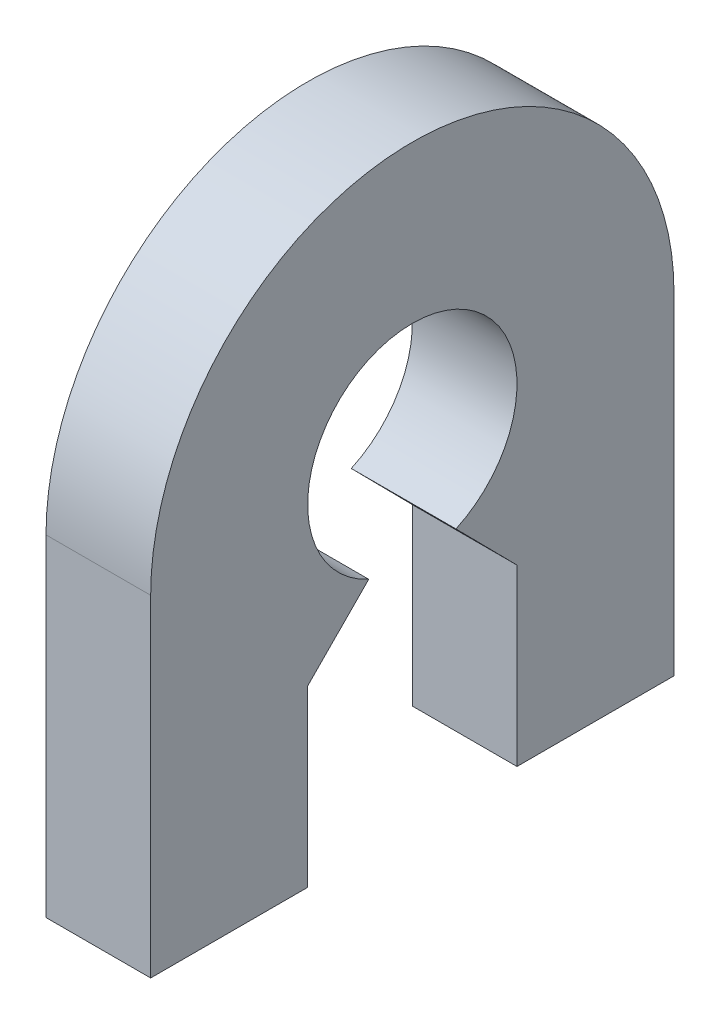
ISO-10303-21;
HEADER;
FILE_DESCRIPTION(('STEP AP214'),'2;1');
FILE_NAME('part.step','',(''),(''),'','','');
FILE_SCHEMA(('AUTOMOTIVE_DESIGN { 1 0 10303 214 1 1 1 1 }'));
ENDSEC;
DATA;
#1=APPLICATION_CONTEXT('core data for automotive mechanical design processes');
#2=APPLICATION_PROTOCOL_DEFINITION('international standard','automotive_design',2000,#1);
#3=PRODUCT_CONTEXT('',#1,'mechanical');
#4=PRODUCT('Part','Part','',(#3));
#5=PRODUCT_RELATED_PRODUCT_CATEGORY('part','',(#4));
#6=PRODUCT_DEFINITION_FORMATION('','',#4);
#7=PRODUCT_DEFINITION_CONTEXT('part definition',#1,'design');
#8=PRODUCT_DEFINITION('design','',#6,#7);
#9=PRODUCT_DEFINITION_SHAPE('','',#8);
#10=(LENGTH_UNIT() NAMED_UNIT(*) SI_UNIT(.MILLI.,.METRE.));
#11=(NAMED_UNIT(*) PLANE_ANGLE_UNIT() SI_UNIT($,.RADIAN.));
#12=(NAMED_UNIT(*) SI_UNIT($,.STERADIAN.) SOLID_ANGLE_UNIT());
#13=UNCERTAINTY_MEASURE_WITH_UNIT(LENGTH_MEASURE(1.E-05),#10,'distance_accuracy_value','');
#14=(GEOMETRIC_REPRESENTATION_CONTEXT(3) GLOBAL_UNCERTAINTY_ASSIGNED_CONTEXT((#13)) GLOBAL_UNIT_ASSIGNED_CONTEXT((#10,
#11,#12)) REPRESENTATION_CONTEXT('',''));
#15=CARTESIAN_POINT('',(0.,0.,0.));
#16=DIRECTION('',(0.,0.,1.));
#17=DIRECTION('',(1.,0.,0.));
#18=AXIS2_PLACEMENT_3D('',#15,#16,#17);
#19=CARTESIAN_POINT('',(3.,24.,0.));
#20=DIRECTION('',(-1.,0.,0.));
#21=DIRECTION('',(0.,0.,1.));
#22=AXIS2_PLACEMENT_3D('',#19,#20,#21);
#23=CYLINDRICAL_SURFACE('',#22,15.);
#24=CARTESIAN_POINT('',(-3.,24.,0.));
#25=DIRECTION('',(1.,0.,0.));
#26=DIRECTION('',(0.,0.,1.));
#27=AXIS2_PLACEMENT_3D('',#24,#25,#26);
#28=CIRCLE('',#27,15.);
#29=CARTESIAN_POINT('',(-3.,24.,-15.));
#30=VERTEX_POINT('',#29);
#31=CARTESIAN_POINT('',(-3.,24.,15.));
#32=VERTEX_POINT('',#31);
#33=EDGE_CURVE('E143',#30,#32,#28,.T.);
#34=ORIENTED_EDGE('',*,*,#33,.T.);
#35=DIRECTION('',(-1.,0.,0.));
#36=VECTOR('',#35,1.);
#37=CARTESIAN_POINT('',(3.,24.,15.));
#38=LINE('',#37,#36);
#39=CARTESIAN_POINT('',(3.,24.,15.));
#40=VERTEX_POINT('',#39);
#41=EDGE_CURVE('E11',#40,#32,#38,.T.);
#42=ORIENTED_EDGE('',*,*,#41,.F.);
#43=CARTESIAN_POINT('',(3.,24.,0.));
#44=DIRECTION('',(1.,0.,0.));
#45=DIRECTION('',(0.,0.,1.));
#46=AXIS2_PLACEMENT_3D('',#43,#44,#45);
#47=CIRCLE('',#46,15.);
#48=CARTESIAN_POINT('',(3.,24.,-15.));
#49=VERTEX_POINT('',#48);
#50=EDGE_CURVE('E161',#49,#40,#47,.T.);
#51=ORIENTED_EDGE('',*,*,#50,.F.);
#52=DIRECTION('',(-1.,0.,0.));
#53=VECTOR('',#52,1.);
#54=CARTESIAN_POINT('',(3.,24.,-15.));
#55=LINE('',#54,#53);
#56=EDGE_CURVE('E139',#49,#30,#55,.T.);
#57=ORIENTED_EDGE('',*,*,#56,.T.);
#58=EDGE_LOOP('',(#34,#42,#51,#57));
#59=FACE_BOUND('',#58,.T.);
#60=ADVANCED_FACE('F35',(#59),#23,.T.);
#61=CARTESIAN_POINT('',(3.,5.,15.));
#62=DIRECTION('',(0.,0.,-1.));
#63=DIRECTION('',(-1.,0.,0.));
#64=AXIS2_PLACEMENT_3D('',#61,#62,#63);
#65=PLANE('',#64);
#66=DIRECTION('',(0.,-1.,0.));
#67=VECTOR('',#66,1.);
#68=CARTESIAN_POINT('',(-3.,5.,15.));
#69=LINE('',#68,#67);
#70=CARTESIAN_POINT('',(-3.,5.,15.));
#71=VERTEX_POINT('',#70);
#72=EDGE_CURVE('E146',#32,#71,#69,.T.);
#73=ORIENTED_EDGE('',*,*,#72,.T.);
#74=DIRECTION('',(-1.,0.,0.));
#75=VECTOR('',#74,1.);
#76=CARTESIAN_POINT('',(3.,5.,15.));
#77=LINE('',#76,#75);
#78=CARTESIAN_POINT('',(3.,5.,15.));
#79=VERTEX_POINT('',#78);
#80=EDGE_CURVE('E43',#79,#71,#77,.T.);
#81=ORIENTED_EDGE('',*,*,#80,.F.);
#82=DIRECTION('',(0.,-1.,0.));
#83=VECTOR('',#82,1.);
#84=CARTESIAN_POINT('',(3.,5.,15.));
#85=LINE('',#84,#83);
#86=EDGE_CURVE('E100',#40,#79,#85,.T.);
#87=ORIENTED_EDGE('',*,*,#86,.F.);
#88=ORIENTED_EDGE('',*,*,#41,.T.);
#89=EDGE_LOOP('',(#73,#81,#87,#88));
#90=FACE_BOUND('',#89,.T.);
#91=ADVANCED_FACE('F210',(#90),#65,.F.);
#92=CARTESIAN_POINT('',(3.,5.,6.00000000000001));
#93=DIRECTION('',(0.,1.,0.));
#94=DIRECTION('',(0.,0.,1.));
#95=AXIS2_PLACEMENT_3D('',#92,#93,#94);
#96=PLANE('',#95);
#97=DIRECTION('',(0.,0.,-1.));
#98=VECTOR('',#97,1.);
#99=CARTESIAN_POINT('',(-3.,5.,6.00000000000001));
#100=LINE('',#99,#98);
#101=CARTESIAN_POINT('',(-3.,5.,6.00000000000001));
#102=VERTEX_POINT('',#101);
#103=EDGE_CURVE('E148',#71,#102,#100,.T.);
#104=ORIENTED_EDGE('',*,*,#103,.T.);
#105=DIRECTION('',(-1.,0.,0.));
#106=VECTOR('',#105,1.);
#107=CARTESIAN_POINT('',(3.,5.,6.00000000000001));
#108=LINE('',#107,#106);
#109=CARTESIAN_POINT('',(3.,5.,6.00000000000001));
#110=VERTEX_POINT('',#109);
#111=EDGE_CURVE('E174',#110,#102,#108,.T.);
#112=ORIENTED_EDGE('',*,*,#111,.F.);
#113=DIRECTION('',(0.,0.,-1.));
#114=VECTOR('',#113,1.);
#115=CARTESIAN_POINT('',(3.,5.,6.00000000000001));
#116=LINE('',#115,#114);
#117=EDGE_CURVE('E182',#79,#110,#116,.T.);
#118=ORIENTED_EDGE('',*,*,#117,.F.);
#119=ORIENTED_EDGE('',*,*,#80,.T.);
#120=EDGE_LOOP('',(#104,#112,#118,#119));
#121=FACE_BOUND('',#120,.T.);
#122=ADVANCED_FACE('F180',(#121),#96,.F.);
#123=CARTESIAN_POINT('',(3.,15.,6.00000000000001));
#124=DIRECTION('',(0.,0.,1.));
#125=DIRECTION('',(1.,0.,0.));
#126=AXIS2_PLACEMENT_3D('',#123,#124,#125);
#127=PLANE('',#126);
#128=DIRECTION('',(0.,1.,0.));
#129=VECTOR('',#128,1.);
#130=CARTESIAN_POINT('',(-3.,15.,6.00000000000001));
#131=LINE('',#130,#129);
#132=CARTESIAN_POINT('',(-3.,15.,6.00000000000001));
#133=VERTEX_POINT('',#132);
#134=EDGE_CURVE('E150',#102,#133,#131,.T.);
#135=ORIENTED_EDGE('',*,*,#134,.T.);
#136=DIRECTION('',(-1.,0.,0.));
#137=VECTOR('',#136,1.);
#138=CARTESIAN_POINT('',(3.,15.,6.00000000000001));
#139=LINE('',#138,#137);
#140=CARTESIAN_POINT('',(3.,15.,6.00000000000001));
#141=VERTEX_POINT('',#140);
#142=EDGE_CURVE('E171',#141,#133,#139,.T.);
#143=ORIENTED_EDGE('',*,*,#142,.F.);
#144=DIRECTION('',(0.,1.,0.));
#145=VECTOR('',#144,1.);
#146=CARTESIAN_POINT('',(3.,15.,6.00000000000001));
#147=LINE('',#146,#145);
#148=EDGE_CURVE('E200',#110,#141,#147,.T.);
#149=ORIENTED_EDGE('',*,*,#148,.F.);
#150=ORIENTED_EDGE('',*,*,#111,.T.);
#151=EDGE_LOOP('',(#135,#143,#149,#150));
#152=FACE_BOUND('',#151,.T.);
#153=ADVANCED_FACE('F191',(#152),#127,.F.);
#154=CARTESIAN_POINT('',(3.,18.5456439426821,2.50000000000001));
#155=DIRECTION('',(0.,0.702511174954528,0.711672712041152));
#156=DIRECTION('',(0.,-0.711672712041152,0.702511174954528));
#157=AXIS2_PLACEMENT_3D('',#154,#155,#156);
#158=PLANE('',#157);
#159=DIRECTION('',(0.,0.711672712041152,-0.702511174954528));
#160=VECTOR('',#159,1.);
#161=CARTESIAN_POINT('',(-3.,18.5456439426821,2.50000000000001));
#162=LINE('',#161,#160);
#163=CARTESIAN_POINT('',(-3.,18.5456439426821,2.50000000000001));
#164=VERTEX_POINT('',#163);
#165=EDGE_CURVE('E152',#133,#164,#162,.T.);
#166=ORIENTED_EDGE('',*,*,#165,.T.);
#167=DIRECTION('',(-1.,0.,0.));
#168=VECTOR('',#167,1.);
#169=CARTESIAN_POINT('',(3.,18.5456439426821,2.50000000000001));
#170=LINE('',#169,#168);
#171=CARTESIAN_POINT('',(3.,18.5456439426821,2.50000000000001));
#172=VERTEX_POINT('',#171);
#173=EDGE_CURVE('E168',#172,#164,#170,.T.);
#174=ORIENTED_EDGE('',*,*,#173,.F.);
#175=DIRECTION('',(0.,0.711672712041152,-0.702511174954528));
#176=VECTOR('',#175,1.);
#177=CARTESIAN_POINT('',(3.,18.5456439426821,2.50000000000001));
#178=LINE('',#177,#176);
#179=EDGE_CURVE('E197',#141,#172,#178,.T.);
#180=ORIENTED_EDGE('',*,*,#179,.F.);
#181=ORIENTED_EDGE('',*,*,#142,.T.);
#182=EDGE_LOOP('',(#166,#174,#180,#181));
#183=FACE_BOUND('',#182,.T.);
#184=ADVANCED_FACE('F195',(#183),#158,.F.);
#185=CARTESIAN_POINT('',(3.,24.,0.));
#186=DIRECTION('',(-1.,0.,0.));
#187=DIRECTION('',(0.,0.,1.));
#188=AXIS2_PLACEMENT_3D('',#185,#186,#187);
#189=CYLINDRICAL_SURFACE('',#188,6.);
#190=CARTESIAN_POINT('',(-3.,24.,0.));
#191=DIRECTION('',(-1.,0.,0.));
#192=DIRECTION('',(0.,0.,-1.));
#193=AXIS2_PLACEMENT_3D('',#190,#191,#192);
#194=CIRCLE('',#193,6.);
#195=CARTESIAN_POINT('',(-3.,18.5456439426821,-2.49999999999999));
#196=VERTEX_POINT('',#195);
#197=EDGE_CURVE('E154',#164,#196,#194,.T.);
#198=ORIENTED_EDGE('',*,*,#197,.T.);
#199=DIRECTION('',(-1.,0.,0.));
#200=VECTOR('',#199,1.);
#201=CARTESIAN_POINT('',(3.,18.5456439426821,-2.49999999999999));
#202=LINE('',#201,#200);
#203=CARTESIAN_POINT('',(3.,18.5456439426821,-2.49999999999999));
#204=VERTEX_POINT('',#203);
#205=EDGE_CURVE('E165',#204,#196,#202,.T.);
#206=ORIENTED_EDGE('',*,*,#205,.F.);
#207=CARTESIAN_POINT('',(3.,24.,0.));
#208=DIRECTION('',(-1.,0.,0.));
#209=DIRECTION('',(0.,0.,-1.));
#210=AXIS2_PLACEMENT_3D('',#207,#208,#209);
#211=CIRCLE('',#210,6.);
#212=EDGE_CURVE('E199',#172,#204,#211,.T.);
#213=ORIENTED_EDGE('',*,*,#212,.F.);
#214=ORIENTED_EDGE('',*,*,#173,.T.);
#215=EDGE_LOOP('',(#198,#206,#213,#214));
#216=FACE_BOUND('',#215,.T.);
#217=ADVANCED_FACE('F222',(#216),#189,.F.);
#218=CARTESIAN_POINT('',(3.,15.,-6.));
#219=DIRECTION('',(0.,0.702511174954528,-0.711672712041152));
#220=DIRECTION('',(0.,0.711672712041152,0.702511174954528));
#221=AXIS2_PLACEMENT_3D('',#218,#219,#220);
#222=PLANE('',#221);
#223=DIRECTION('',(0.,-0.711672712041152,-0.702511174954528));
#224=VECTOR('',#223,1.);
#225=CARTESIAN_POINT('',(-3.,15.,-6.));
#226=LINE('',#225,#224);
#227=CARTESIAN_POINT('',(-3.,15.,-6.));
#228=VERTEX_POINT('',#227);
#229=EDGE_CURVE('E156',#196,#228,#226,.T.);
#230=ORIENTED_EDGE('',*,*,#229,.T.);
#231=DIRECTION('',(-1.,0.,0.));
#232=VECTOR('',#231,1.);
#233=CARTESIAN_POINT('',(3.,15.,-6.));
#234=LINE('',#233,#232);
#235=CARTESIAN_POINT('',(3.,15.,-6.));
#236=VERTEX_POINT('',#235);
#237=EDGE_CURVE('E134',#236,#228,#234,.T.);
#238=ORIENTED_EDGE('',*,*,#237,.F.);
#239=DIRECTION('',(0.,-0.711672712041152,-0.702511174954528));
#240=VECTOR('',#239,1.);
#241=CARTESIAN_POINT('',(3.,15.,-6.));
#242=LINE('',#241,#240);
#243=EDGE_CURVE('E125',#204,#236,#242,.T.);
#244=ORIENTED_EDGE('',*,*,#243,.F.);
#245=ORIENTED_EDGE('',*,*,#205,.T.);
#246=EDGE_LOOP('',(#230,#238,#244,#245));
#247=FACE_BOUND('',#246,.T.);
#248=ADVANCED_FACE('F225',(#247),#222,.F.);
#249=CARTESIAN_POINT('',(3.,5.,-6.));
#250=DIRECTION('',(0.,0.,-1.));
#251=DIRECTION('',(-1.,0.,0.));
#252=AXIS2_PLACEMENT_3D('',#249,#250,#251);
#253=PLANE('',#252);
#254=DIRECTION('',(0.,-1.,0.));
#255=VECTOR('',#254,1.);
#256=CARTESIAN_POINT('',(-3.,5.,-6.));
#257=LINE('',#256,#255);
#258=CARTESIAN_POINT('',(-3.,5.,-6.));
#259=VERTEX_POINT('',#258);
#260=EDGE_CURVE('E133',#228,#259,#257,.T.);
#261=ORIENTED_EDGE('',*,*,#260,.T.);
#262=DIRECTION('',(-1.,0.,0.));
#263=VECTOR('',#262,1.);
#264=CARTESIAN_POINT('',(3.,5.,-6.));
#265=LINE('',#264,#263);
#266=CARTESIAN_POINT('',(3.,5.,-6.));
#267=VERTEX_POINT('',#266);
#268=EDGE_CURVE('E130',#267,#259,#265,.T.);
#269=ORIENTED_EDGE('',*,*,#268,.F.);
#270=DIRECTION('',(0.,-1.,0.));
#271=VECTOR('',#270,1.);
#272=CARTESIAN_POINT('',(3.,5.,-6.));
#273=LINE('',#272,#271);
#274=EDGE_CURVE('E119',#236,#267,#273,.T.);
#275=ORIENTED_EDGE('',*,*,#274,.F.);
#276=ORIENTED_EDGE('',*,*,#237,.T.);
#277=EDGE_LOOP('',(#261,#269,#275,#276));
#278=FACE_BOUND('',#277,.T.);
#279=ADVANCED_FACE('F131',(#278),#253,.F.);
#280=CARTESIAN_POINT('',(3.,5.,-15.));
#281=DIRECTION('',(0.,1.,0.));
#282=DIRECTION('',(0.,0.,1.));
#283=AXIS2_PLACEMENT_3D('',#280,#281,#282);
#284=PLANE('',#283);
#285=DIRECTION('',(0.,0.,-1.));
#286=VECTOR('',#285,1.);
#287=CARTESIAN_POINT('',(-3.,5.,-15.));
#288=LINE('',#287,#286);
#289=CARTESIAN_POINT('',(-3.,5.,-15.));
#290=VERTEX_POINT('',#289);
#291=EDGE_CURVE('E86',#259,#290,#288,.T.);
#292=ORIENTED_EDGE('',*,*,#291,.T.);
#293=DIRECTION('',(-1.,0.,0.));
#294=VECTOR('',#293,1.);
#295=CARTESIAN_POINT('',(3.,5.,-15.));
#296=LINE('',#295,#294);
#297=CARTESIAN_POINT('',(3.,5.,-15.));
#298=VERTEX_POINT('',#297);
#299=EDGE_CURVE('E135',#298,#290,#296,.T.);
#300=ORIENTED_EDGE('',*,*,#299,.F.);
#301=DIRECTION('',(0.,0.,-1.));
#302=VECTOR('',#301,1.);
#303=CARTESIAN_POINT('',(3.,5.,-15.));
#304=LINE('',#303,#302);
#305=EDGE_CURVE('E123',#267,#298,#304,.T.);
#306=ORIENTED_EDGE('',*,*,#305,.F.);
#307=ORIENTED_EDGE('',*,*,#268,.T.);
#308=EDGE_LOOP('',(#292,#300,#306,#307));
#309=FACE_BOUND('',#308,.T.);
#310=ADVANCED_FACE('F137',(#309),#284,.F.);
#311=CARTESIAN_POINT('',(3.,5.,-15.));
#312=DIRECTION('',(0.,0.,1.));
#313=DIRECTION('',(1.,0.,0.));
#314=AXIS2_PLACEMENT_3D('',#311,#312,#313);
#315=PLANE('',#314);
#316=DIRECTION('',(0.,1.,0.));
#317=VECTOR('',#316,1.);
#318=CARTESIAN_POINT('',(-3.,5.,-15.));
#319=LINE('',#318,#317);
#320=EDGE_CURVE('E92',#290,#30,#319,.T.);
#321=ORIENTED_EDGE('',*,*,#320,.T.);
#322=ORIENTED_EDGE('',*,*,#56,.F.);
#323=DIRECTION('',(0.,1.,0.));
#324=VECTOR('',#323,1.);
#325=CARTESIAN_POINT('',(3.,5.,-15.));
#326=LINE('',#325,#324);
#327=EDGE_CURVE('E51',#298,#49,#326,.T.);
#328=ORIENTED_EDGE('',*,*,#327,.F.);
#329=ORIENTED_EDGE('',*,*,#299,.T.);
#330=EDGE_LOOP('',(#321,#322,#328,#329));
#331=FACE_BOUND('',#330,.T.);
#332=ADVANCED_FACE('F234',(#331),#315,.F.);
#333=CARTESIAN_POINT('',(3.,24.,0.));
#334=DIRECTION('',(-1.,0.,0.));
#335=DIRECTION('',(0.,0.,1.));
#336=AXIS2_PLACEMENT_3D('',#333,#334,#335);
#337=PLANE('',#336);
#338=ORIENTED_EDGE('',*,*,#50,.T.);
#339=ORIENTED_EDGE('',*,*,#86,.T.);
#340=ORIENTED_EDGE('',*,*,#117,.T.);
#341=ORIENTED_EDGE('',*,*,#148,.T.);
#342=ORIENTED_EDGE('',*,*,#179,.T.);
#343=ORIENTED_EDGE('',*,*,#212,.T.);
#344=ORIENTED_EDGE('',*,*,#243,.T.);
#345=ORIENTED_EDGE('',*,*,#274,.T.);
#346=ORIENTED_EDGE('',*,*,#305,.T.);
#347=ORIENTED_EDGE('',*,*,#327,.T.);
#348=EDGE_LOOP('',(#338,#339,#340,#341,#342,#343,#344,#345,#346,#347));
#349=FACE_BOUND('',#348,.T.);
#350=ADVANCED_FACE('F121',(#349),#337,.F.);
#351=CARTESIAN_POINT('',(-3.,24.,0.));
#352=DIRECTION('',(-1.,0.,0.));
#353=DIRECTION('',(0.,0.,1.));
#354=AXIS2_PLACEMENT_3D('',#351,#352,#353);
#355=PLANE('',#354);
#356=ORIENTED_EDGE('',*,*,#33,.F.);
#357=ORIENTED_EDGE('',*,*,#320,.F.);
#358=ORIENTED_EDGE('',*,*,#291,.F.);
#359=ORIENTED_EDGE('',*,*,#260,.F.);
#360=ORIENTED_EDGE('',*,*,#229,.F.);
#361=ORIENTED_EDGE('',*,*,#197,.F.);
#362=ORIENTED_EDGE('',*,*,#165,.F.);
#363=ORIENTED_EDGE('',*,*,#134,.F.);
#364=ORIENTED_EDGE('',*,*,#103,.F.);
#365=ORIENTED_EDGE('',*,*,#72,.F.);
#366=EDGE_LOOP('',(#356,#357,#358,#359,#360,#361,#362,#363,#364,#365));
#367=FACE_BOUND('',#366,.T.);
#368=ADVANCED_FACE('F186',(#367),#355,.T.);
#369=CLOSED_SHELL('',(#60,#91,#122,#153,#184,#217,#248,#279,#310,#332,#350,#368));
#370=MANIFOLD_SOLID_BREP('B2',#369);
#371=ADVANCED_BREP_SHAPE_REPRESENTATION('',(#18,#370),#14);
#372=SHAPE_DEFINITION_REPRESENTATION(#9,#371);
ENDSEC;
END-ISO-10303-21;
